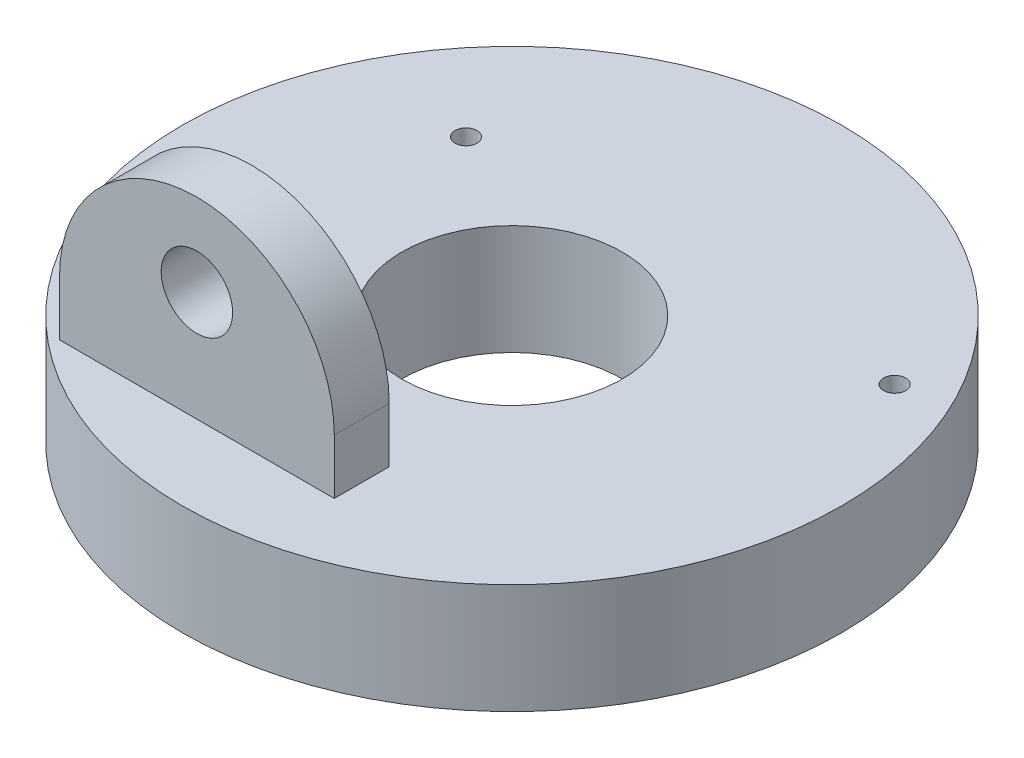
ISO-10303-21;
HEADER;
FILE_DESCRIPTION(('STEP AP214'),'2;1');
FILE_NAME('part.step','',(''),(''),'','','');
FILE_SCHEMA(('AUTOMOTIVE_DESIGN { 1 0 10303 214 1 1 1 1 }'));
ENDSEC;
DATA;
#1=APPLICATION_CONTEXT('core data for automotive mechanical design processes');
#2=APPLICATION_PROTOCOL_DEFINITION('international standard','automotive_design',2000,#1);
#3=PRODUCT_CONTEXT('',#1,'mechanical');
#4=PRODUCT('Part','Part','',(#3));
#5=PRODUCT_RELATED_PRODUCT_CATEGORY('part','',(#4));
#6=PRODUCT_DEFINITION_FORMATION('','',#4);
#7=PRODUCT_DEFINITION_CONTEXT('part definition',#1,'design');
#8=PRODUCT_DEFINITION('design','',#6,#7);
#9=PRODUCT_DEFINITION_SHAPE('','',#8);
#10=(LENGTH_UNIT() NAMED_UNIT(*) SI_UNIT(.MILLI.,.METRE.));
#11=(NAMED_UNIT(*) PLANE_ANGLE_UNIT() SI_UNIT($,.RADIAN.));
#12=(NAMED_UNIT(*) SI_UNIT($,.STERADIAN.) SOLID_ANGLE_UNIT());
#13=UNCERTAINTY_MEASURE_WITH_UNIT(LENGTH_MEASURE(1.E-05),#10,'distance_accuracy_value','');
#14=(GEOMETRIC_REPRESENTATION_CONTEXT(3) GLOBAL_UNCERTAINTY_ASSIGNED_CONTEXT((#13)) GLOBAL_UNIT_ASSIGNED_CONTEXT((#10,
#11,#12)) REPRESENTATION_CONTEXT('',''));
#15=CARTESIAN_POINT('',(0.,0.,0.));
#16=DIRECTION('',(0.,0.,1.));
#17=DIRECTION('',(1.,0.,0.));
#18=AXIS2_PLACEMENT_3D('',#15,#16,#17);
#19=CARTESIAN_POINT('',(-32.3448913021792,-5.65685425442422,-23.9783943291835));
#20=DIRECTION('',(0.,1.,0.));
#21=DIRECTION('',(0.,0.,1.));
#22=AXIS2_PLACEMENT_3D('',#19,#20,#21);
#23=CYLINDRICAL_SURFACE('',#22,2.00000000174366);
#24=CARTESIAN_POINT('',(-32.3448913021792,20.,-23.9783943291835));
#25=DIRECTION('',(0.,1.,0.));
#26=DIRECTION('',(0.,0.,1.));
#27=AXIS2_PLACEMENT_3D('',#24,#25,#26);
#28=CIRCLE('',#27,2.00000000174366);
#29=CARTESIAN_POINT('',(-32.3448913021792,20.,-21.9783943274399));
#30=VERTEX_POINT('',#29);
#31=EDGE_CURVE('E131',#30,#30,#28,.T.);
#32=ORIENTED_EDGE('',*,*,#31,.T.);
#33=EDGE_LOOP('',(#32));
#34=FACE_BOUND('',#33,.T.);
#35=CARTESIAN_POINT('',(-32.3448913021792,4.,-23.9783943291835));
#36=DIRECTION('',(0.,-1.,0.));
#37=DIRECTION('',(0.,0.,-1.));
#38=AXIS2_PLACEMENT_3D('',#35,#36,#37);
#39=CIRCLE('',#38,2.00000000174366);
#40=CARTESIAN_POINT('',(-32.3448913021792,4.,-25.9783943309272));
#41=VERTEX_POINT('',#40);
#42=EDGE_CURVE('E47',#41,#41,#39,.F.);
#43=ORIENTED_EDGE('',*,*,#42,.F.);
#44=EDGE_LOOP('',(#43));
#45=FACE_BOUND('',#44,.T.);
#46=ADVANCED_FACE('F43',(#34,#45),#23,.F.);
#47=CARTESIAN_POINT('',(45.6551086978208,-5.65685425442422,-23.9783943291835));
#48=DIRECTION('',(0.,1.,0.));
#49=DIRECTION('',(0.,0.,1.));
#50=AXIS2_PLACEMENT_3D('',#47,#48,#49);
#51=CYLINDRICAL_SURFACE('',#50,2.00000000174367);
#52=CARTESIAN_POINT('',(45.6551086978208,20.,-23.9783943291835));
#53=DIRECTION('',(0.,1.,0.));
#54=DIRECTION('',(0.,0.,1.));
#55=AXIS2_PLACEMENT_3D('',#52,#53,#54);
#56=CIRCLE('',#55,2.00000000174367);
#57=CARTESIAN_POINT('',(45.6551086978208,20.,-21.9783943274398));
#58=VERTEX_POINT('',#57);
#59=EDGE_CURVE('E146',#58,#58,#56,.T.);
#60=ORIENTED_EDGE('',*,*,#59,.T.);
#61=EDGE_LOOP('',(#60));
#62=FACE_BOUND('',#61,.T.);
#63=CARTESIAN_POINT('',(45.6551086978208,4.,-23.9783943291835));
#64=DIRECTION('',(0.,-1.,0.));
#65=DIRECTION('',(0.,0.,-1.));
#66=AXIS2_PLACEMENT_3D('',#63,#64,#65);
#67=CIRCLE('',#66,2.00000000174367);
#68=CARTESIAN_POINT('',(45.6551086978208,4.,-25.9783943309272));
#69=VERTEX_POINT('',#68);
#70=EDGE_CURVE('E125',#69,#69,#67,.F.);
#71=ORIENTED_EDGE('',*,*,#70,.F.);
#72=EDGE_LOOP('',(#71));
#73=FACE_BOUND('',#72,.T.);
#74=ADVANCED_FACE('F167',(#62,#73),#51,.F.);
#75=CARTESIAN_POINT('',(0.,20.,0.));
#76=DIRECTION('',(0.,1.,0.));
#77=DIRECTION('',(0.,0.,1.));
#78=AXIS2_PLACEMENT_3D('',#75,#76,#77);
#79=PLANE('',#78);
#80=ORIENTED_EDGE('',*,*,#59,.F.);
#81=EDGE_LOOP('',(#80));
#82=FACE_BOUND('',#81,.T.);
#83=ORIENTED_EDGE('',*,*,#31,.F.);
#84=EDGE_LOOP('',(#83));
#85=FACE_BOUND('',#84,.T.);
#86=CARTESIAN_POINT('',(0.,20.,0.));
#87=DIRECTION('',(0.,1.,0.));
#88=DIRECTION('',(0.,0.,1.));
#89=AXIS2_PLACEMENT_3D('',#86,#87,#88);
#90=CIRCLE('',#89,20.05);
#91=CARTESIAN_POINT('',(0.,20.,20.05));
#92=VERTEX_POINT('',#91);
#93=EDGE_CURVE('E157',#92,#92,#90,.T.);
#94=ORIENTED_EDGE('',*,*,#93,.F.);
#95=EDGE_LOOP('',(#94));
#96=FACE_BOUND('',#95,.T.);
#97=CARTESIAN_POINT('',(0.,20.,0.));
#98=DIRECTION('',(0.,1.,0.));
#99=DIRECTION('',(0.,0.,1.));
#100=AXIS2_PLACEMENT_3D('',#97,#98,#99);
#101=CIRCLE('',#100,60.);
#102=CARTESIAN_POINT('',(0.,20.,60.));
#103=VERTEX_POINT('',#102);
#104=EDGE_CURVE('E11',#103,#103,#101,.T.);
#105=ORIENTED_EDGE('',*,*,#104,.T.);
#106=EDGE_LOOP('',(#105));
#107=FACE_BOUND('',#106,.T.);
#108=DIRECTION('',(0.,0.,1.));
#109=VECTOR('',#108,1.);
#110=CARTESIAN_POINT('',(-37.3448913032883,20.,35.));
#111=LINE('',#110,#109);
#112=CARTESIAN_POINT('',(-37.3448913032883,20.,35.));
#113=VERTEX_POINT('',#112);
#114=CARTESIAN_POINT('',(-37.3448913032883,20.,45.));
#115=VERTEX_POINT('',#114);
#116=EDGE_CURVE('E60',#113,#115,#111,.T.);
#117=ORIENTED_EDGE('',*,*,#116,.F.);
#118=DIRECTION('',(1.,0.,0.));
#119=VECTOR('',#118,1.);
#120=CARTESIAN_POINT('',(-37.3448913032883,20.,35.));
#121=LINE('',#120,#119);
#122=CARTESIAN_POINT('',(12.6551086967117,20.,35.));
#123=VERTEX_POINT('',#122);
#124=EDGE_CURVE('E64',#113,#123,#121,.T.);
#125=ORIENTED_EDGE('',*,*,#124,.T.);
#126=DIRECTION('',(0.,0.,1.));
#127=VECTOR('',#126,1.);
#128=CARTESIAN_POINT('',(12.6551086967117,20.,35.));
#129=LINE('',#128,#127);
#130=CARTESIAN_POINT('',(12.6551086967117,20.,45.));
#131=VERTEX_POINT('',#130);
#132=EDGE_CURVE('E96',#123,#131,#129,.T.);
#133=ORIENTED_EDGE('',*,*,#132,.T.);
#134=DIRECTION('',(1.,0.,0.));
#135=VECTOR('',#134,1.);
#136=CARTESIAN_POINT('',(-37.3448913032883,20.,45.));
#137=LINE('',#136,#135);
#138=EDGE_CURVE('E112',#115,#131,#137,.T.);
#139=ORIENTED_EDGE('',*,*,#138,.F.);
#140=EDGE_LOOP('',(#117,#125,#133,#139));
#141=FACE_BOUND('',#140,.T.);
#142=ADVANCED_FACE('F164',(#82,#85,#96,#107,#141),#79,.T.);
#143=CARTESIAN_POINT('',(0.,20.,0.));
#144=DIRECTION('',(0.,-1.,0.));
#145=DIRECTION('',(0.,0.,-1.));
#146=AXIS2_PLACEMENT_3D('',#143,#144,#145);
#147=CYLINDRICAL_SURFACE('',#146,60.);
#148=ORIENTED_EDGE('',*,*,#104,.F.);
#149=EDGE_LOOP('',(#148));
#150=FACE_BOUND('',#149,.T.);
#151=CARTESIAN_POINT('',(0.,0.,0.));
#152=DIRECTION('',(0.,1.,0.));
#153=DIRECTION('',(0.,0.,1.));
#154=AXIS2_PLACEMENT_3D('',#151,#152,#153);
#155=CIRCLE('',#154,60.);
#156=CARTESIAN_POINT('',(0.,0.,60.));
#157=VERTEX_POINT('',#156);
#158=EDGE_CURVE('E52',#157,#157,#155,.T.);
#159=ORIENTED_EDGE('',*,*,#158,.T.);
#160=EDGE_LOOP('',(#159));
#161=FACE_BOUND('',#160,.T.);
#162=ADVANCED_FACE('F45',(#150,#161),#147,.T.);
#163=CARTESIAN_POINT('',(0.,0.,0.));
#164=DIRECTION('',(0.,1.,0.));
#165=DIRECTION('',(0.,0.,1.));
#166=AXIS2_PLACEMENT_3D('',#163,#164,#165);
#167=PLANE('',#166);
#168=CARTESIAN_POINT('',(45.6551086978208,0.,-23.9783943291835));
#169=DIRECTION('',(0.,-1.,0.));
#170=DIRECTION('',(0.,0.,-1.));
#171=AXIS2_PLACEMENT_3D('',#168,#169,#170);
#172=CIRCLE('',#171,3.99999999613521);
#173=CARTESIAN_POINT('',(45.6551086978208,0.,-27.9783943253187));
#174=VERTEX_POINT('',#173);
#175=EDGE_CURVE('E133',#174,#174,#172,.T.);
#176=ORIENTED_EDGE('',*,*,#175,.F.);
#177=EDGE_LOOP('',(#176));
#178=FACE_BOUND('',#177,.T.);
#179=CARTESIAN_POINT('',(-32.3448913021792,0.,-23.9783943291835));
#180=DIRECTION('',(0.,-1.,0.));
#181=DIRECTION('',(0.,0.,-1.));
#182=AXIS2_PLACEMENT_3D('',#179,#180,#181);
#183=CIRCLE('',#182,3.9999999961352);
#184=CARTESIAN_POINT('',(-32.3448913021792,0.,-27.9783943253187));
#185=VERTEX_POINT('',#184);
#186=EDGE_CURVE('E138',#185,#185,#183,.T.);
#187=ORIENTED_EDGE('',*,*,#186,.F.);
#188=EDGE_LOOP('',(#187));
#189=FACE_BOUND('',#188,.T.);
#190=CARTESIAN_POINT('',(0.,0.,0.));
#191=DIRECTION('',(0.,1.,0.));
#192=DIRECTION('',(0.,0.,1.));
#193=AXIS2_PLACEMENT_3D('',#190,#191,#192);
#194=CIRCLE('',#193,20.05);
#195=CARTESIAN_POINT('',(0.,0.,20.05));
#196=VERTEX_POINT('',#195);
#197=EDGE_CURVE('E116',#196,#196,#194,.T.);
#198=ORIENTED_EDGE('',*,*,#197,.T.);
#199=EDGE_LOOP('',(#198));
#200=FACE_BOUND('',#199,.T.);
#201=ORIENTED_EDGE('',*,*,#158,.F.);
#202=EDGE_LOOP('',(#201));
#203=FACE_BOUND('',#202,.T.);
#204=ADVANCED_FACE('F174',(#178,#189,#200,#203),#167,.F.);
#205=CARTESIAN_POINT('',(-37.3448913032883,20.,35.));
#206=DIRECTION('',(-1.,0.,0.));
#207=DIRECTION('',(0.,0.,1.));
#208=AXIS2_PLACEMENT_3D('',#205,#206,#207);
#209=PLANE('',#208);
#210=DIRECTION('',(0.,-1.,0.));
#211=VECTOR('',#210,1.);
#212=CARTESIAN_POINT('',(-37.3448913032883,20.,45.));
#213=LINE('',#212,#211);
#214=CARTESIAN_POINT('',(-37.3448913032883,30.,45.));
#215=VERTEX_POINT('',#214);
#216=EDGE_CURVE('E107',#215,#115,#213,.T.);
#217=ORIENTED_EDGE('',*,*,#216,.F.);
#218=DIRECTION('',(0.,0.,1.));
#219=VECTOR('',#218,1.);
#220=CARTESIAN_POINT('',(-37.3448913032883,30.,35.));
#221=LINE('',#220,#219);
#222=CARTESIAN_POINT('',(-37.3448913032883,30.,35.));
#223=VERTEX_POINT('',#222);
#224=EDGE_CURVE('E95',#223,#215,#221,.T.);
#225=ORIENTED_EDGE('',*,*,#224,.F.);
#226=DIRECTION('',(0.,-1.,0.));
#227=VECTOR('',#226,1.);
#228=CARTESIAN_POINT('',(-37.3448913032883,20.,35.));
#229=LINE('',#228,#227);
#230=EDGE_CURVE('E103',#223,#113,#229,.T.);
#231=ORIENTED_EDGE('',*,*,#230,.T.);
#232=ORIENTED_EDGE('',*,*,#116,.T.);
#233=EDGE_LOOP('',(#217,#225,#231,#232));
#234=FACE_BOUND('',#233,.T.);
#235=ADVANCED_FACE('F178',(#234),#209,.T.);
#236=CARTESIAN_POINT('',(-12.3448913032883,30.,35.));
#237=DIRECTION('',(0.,0.,1.));
#238=DIRECTION('',(1.,0.,0.));
#239=AXIS2_PLACEMENT_3D('',#236,#237,#238);
#240=CYLINDRICAL_SURFACE('',#239,25.);
#241=CARTESIAN_POINT('',(-12.3448913032883,30.,45.));
#242=DIRECTION('',(0.,0.,1.));
#243=DIRECTION('',(1.,0.,0.));
#244=AXIS2_PLACEMENT_3D('',#241,#242,#243);
#245=CIRCLE('',#244,25.);
#246=CARTESIAN_POINT('',(12.6551086967117,30.,45.));
#247=VERTEX_POINT('',#246);
#248=EDGE_CURVE('E90',#247,#215,#245,.T.);
#249=ORIENTED_EDGE('',*,*,#248,.F.);
#250=DIRECTION('',(0.,0.,1.));
#251=VECTOR('',#250,1.);
#252=CARTESIAN_POINT('',(12.6551086967117,30.,35.));
#253=LINE('',#252,#251);
#254=CARTESIAN_POINT('',(12.6551086967117,30.,35.));
#255=VERTEX_POINT('',#254);
#256=EDGE_CURVE('E84',#255,#247,#253,.T.);
#257=ORIENTED_EDGE('',*,*,#256,.F.);
#258=CARTESIAN_POINT('',(-12.3448913032883,30.,35.));
#259=DIRECTION('',(0.,0.,1.));
#260=DIRECTION('',(1.,0.,0.));
#261=AXIS2_PLACEMENT_3D('',#258,#259,#260);
#262=CIRCLE('',#261,25.);
#263=EDGE_CURVE('E87',#255,#223,#262,.T.);
#264=ORIENTED_EDGE('',*,*,#263,.T.);
#265=ORIENTED_EDGE('',*,*,#224,.T.);
#266=EDGE_LOOP('',(#249,#257,#264,#265));
#267=FACE_BOUND('',#266,.T.);
#268=ADVANCED_FACE('F86',(#267),#240,.T.);
#269=CARTESIAN_POINT('',(12.6551086967117,20.,35.));
#270=DIRECTION('',(1.,0.,0.));
#271=DIRECTION('',(0.,1.,0.));
#272=AXIS2_PLACEMENT_3D('',#269,#270,#271);
#273=PLANE('',#272);
#274=DIRECTION('',(0.,1.,0.));
#275=VECTOR('',#274,1.);
#276=CARTESIAN_POINT('',(12.6551086967117,20.,45.));
#277=LINE('',#276,#275);
#278=EDGE_CURVE('E115',#131,#247,#277,.T.);
#279=ORIENTED_EDGE('',*,*,#278,.F.);
#280=ORIENTED_EDGE('',*,*,#132,.F.);
#281=DIRECTION('',(0.,1.,0.));
#282=VECTOR('',#281,1.);
#283=CARTESIAN_POINT('',(12.6551086967117,20.,35.));
#284=LINE('',#283,#282);
#285=EDGE_CURVE('E101',#123,#255,#284,.T.);
#286=ORIENTED_EDGE('',*,*,#285,.T.);
#287=ORIENTED_EDGE('',*,*,#256,.T.);
#288=EDGE_LOOP('',(#279,#280,#286,#287));
#289=FACE_BOUND('',#288,.T.);
#290=ADVANCED_FACE('F105',(#289),#273,.T.);
#291=CARTESIAN_POINT('',(-12.3448913032883,30.,35.));
#292=DIRECTION('',(0.,0.,1.));
#293=DIRECTION('',(1.,0.,0.));
#294=AXIS2_PLACEMENT_3D('',#291,#292,#293);
#295=PLANE('',#294);
#296=CARTESIAN_POINT('',(-12.3448913032883,40.,35.));
#297=DIRECTION('',(0.,0.,1.));
#298=DIRECTION('',(1.,0.,0.));
#299=AXIS2_PLACEMENT_3D('',#296,#297,#298);
#300=CIRCLE('',#299,6.5);
#301=CARTESIAN_POINT('',(-5.84489130328831,40.,35.));
#302=VERTEX_POINT('',#301);
#303=EDGE_CURVE('E154',#302,#302,#300,.F.);
#304=ORIENTED_EDGE('',*,*,#303,.F.);
#305=EDGE_LOOP('',(#304));
#306=FACE_BOUND('',#305,.T.);
#307=ORIENTED_EDGE('',*,*,#124,.F.);
#308=ORIENTED_EDGE('',*,*,#230,.F.);
#309=ORIENTED_EDGE('',*,*,#263,.F.);
#310=ORIENTED_EDGE('',*,*,#285,.F.);
#311=EDGE_LOOP('',(#307,#308,#309,#310));
#312=FACE_BOUND('',#311,.T.);
#313=ADVANCED_FACE('F100',(#306,#312),#295,.F.);
#314=CARTESIAN_POINT('',(-12.3448913032883,30.,45.));
#315=DIRECTION('',(0.,0.,1.));
#316=DIRECTION('',(1.,0.,0.));
#317=AXIS2_PLACEMENT_3D('',#314,#315,#316);
#318=PLANE('',#317);
#319=CARTESIAN_POINT('',(-12.3448913032883,40.,45.));
#320=DIRECTION('',(0.,0.,1.));
#321=DIRECTION('',(1.,0.,0.));
#322=AXIS2_PLACEMENT_3D('',#319,#320,#321);
#323=CIRCLE('',#322,6.5);
#324=CARTESIAN_POINT('',(-5.84489130328831,40.,45.));
#325=VERTEX_POINT('',#324);
#326=EDGE_CURVE('E149',#325,#325,#323,.T.);
#327=ORIENTED_EDGE('',*,*,#326,.F.);
#328=EDGE_LOOP('',(#327));
#329=FACE_BOUND('',#328,.T.);
#330=ORIENTED_EDGE('',*,*,#138,.T.);
#331=ORIENTED_EDGE('',*,*,#278,.T.);
#332=ORIENTED_EDGE('',*,*,#248,.T.);
#333=ORIENTED_EDGE('',*,*,#216,.T.);
#334=EDGE_LOOP('',(#330,#331,#332,#333));
#335=FACE_BOUND('',#334,.T.);
#336=ADVANCED_FACE('F206',(#329,#335),#318,.T.);
#337=CARTESIAN_POINT('',(0.,0.,0.));
#338=DIRECTION('',(0.,1.,0.));
#339=DIRECTION('',(0.,0.,1.));
#340=AXIS2_PLACEMENT_3D('',#337,#338,#339);
#341=CYLINDRICAL_SURFACE('',#340,20.05);
#342=ORIENTED_EDGE('',*,*,#197,.F.);
#343=EDGE_LOOP('',(#342));
#344=FACE_BOUND('',#343,.T.);
#345=ORIENTED_EDGE('',*,*,#93,.T.);
#346=EDGE_LOOP('',(#345));
#347=FACE_BOUND('',#346,.T.);
#348=ADVANCED_FACE('F162',(#344,#347),#341,.F.);
#349=CARTESIAN_POINT('',(-12.3448913032883,40.,16.6152236891498));
#350=DIRECTION('',(0.,0.,1.));
#351=DIRECTION('',(1.,0.,0.));
#352=AXIS2_PLACEMENT_3D('',#349,#350,#351);
#353=CYLINDRICAL_SURFACE('',#352,6.5);
#354=ORIENTED_EDGE('',*,*,#303,.T.);
#355=EDGE_LOOP('',(#354));
#356=FACE_BOUND('',#355,.T.);
#357=ORIENTED_EDGE('',*,*,#326,.T.);
#358=EDGE_LOOP('',(#357));
#359=FACE_BOUND('',#358,.T.);
#360=ADVANCED_FACE('F199',(#356,#359),#353,.F.);
#361=CARTESIAN_POINT('',(45.6551086978208,4.,-23.9783943291835));
#362=DIRECTION('',(0.,-1.,0.));
#363=DIRECTION('',(0.,0.,-1.));
#364=AXIS2_PLACEMENT_3D('',#361,#362,#363);
#365=PLANE('',#364);
#366=CARTESIAN_POINT('',(45.6551086978208,4.,-23.9783943291835));
#367=DIRECTION('',(0.,-1.,0.));
#368=DIRECTION('',(0.,0.,-1.));
#369=AXIS2_PLACEMENT_3D('',#366,#367,#368);
#370=CIRCLE('',#369,3.99999999613521);
#371=CARTESIAN_POINT('',(45.6551086978208,4.,-27.9783943253187));
#372=VERTEX_POINT('',#371);
#373=EDGE_CURVE('E127',#372,#372,#370,.T.);
#374=ORIENTED_EDGE('',*,*,#373,.T.);
#375=EDGE_LOOP('',(#374));
#376=FACE_BOUND('',#375,.T.);
#377=ORIENTED_EDGE('',*,*,#70,.T.);
#378=EDGE_LOOP('',(#377));
#379=FACE_BOUND('',#378,.T.);
#380=ADVANCED_FACE('F202',(#376,#379),#365,.T.);
#381=CARTESIAN_POINT('',(45.6551086978208,4.,-23.9783943291835));
#382=DIRECTION('',(0.,-1.,0.));
#383=DIRECTION('',(0.,0.,-1.));
#384=AXIS2_PLACEMENT_3D('',#381,#382,#383);
#385=CYLINDRICAL_SURFACE('',#384,3.99999999613521);
#386=ORIENTED_EDGE('',*,*,#373,.F.);
#387=EDGE_LOOP('',(#386));
#388=FACE_BOUND('',#387,.T.);
#389=ORIENTED_EDGE('',*,*,#175,.T.);
#390=EDGE_LOOP('',(#389));
#391=FACE_BOUND('',#390,.T.);
#392=ADVANCED_FACE('F281',(#388,#391),#385,.F.);
#393=CARTESIAN_POINT('',(-32.3448913021792,4.,-23.9783943291835));
#394=DIRECTION('',(0.,-1.,0.));
#395=DIRECTION('',(0.,0.,-1.));
#396=AXIS2_PLACEMENT_3D('',#393,#394,#395);
#397=PLANE('',#396);
#398=CARTESIAN_POINT('',(-32.3448913021792,4.,-23.9783943291835));
#399=DIRECTION('',(0.,-1.,0.));
#400=DIRECTION('',(0.,0.,-1.));
#401=AXIS2_PLACEMENT_3D('',#398,#399,#400);
#402=CIRCLE('',#401,3.9999999961352);
#403=CARTESIAN_POINT('',(-32.3448913021792,4.,-27.9783943253187));
#404=VERTEX_POINT('',#403);
#405=EDGE_CURVE('E143',#404,#404,#402,.T.);
#406=ORIENTED_EDGE('',*,*,#405,.T.);
#407=EDGE_LOOP('',(#406));
#408=FACE_BOUND('',#407,.T.);
#409=ORIENTED_EDGE('',*,*,#42,.T.);
#410=EDGE_LOOP('',(#409));
#411=FACE_BOUND('',#410,.T.);
#412=ADVANCED_FACE('F289',(#408,#411),#397,.T.);
#413=CARTESIAN_POINT('',(-32.3448913021792,4.,-23.9783943291835));
#414=DIRECTION('',(0.,-1.,0.));
#415=DIRECTION('',(0.,0.,-1.));
#416=AXIS2_PLACEMENT_3D('',#413,#414,#415);
#417=CYLINDRICAL_SURFACE('',#416,3.9999999961352);
#418=ORIENTED_EDGE('',*,*,#405,.F.);
#419=EDGE_LOOP('',(#418));
#420=FACE_BOUND('',#419,.T.);
#421=ORIENTED_EDGE('',*,*,#186,.T.);
#422=EDGE_LOOP('',(#421));
#423=FACE_BOUND('',#422,.T.);
#424=ADVANCED_FACE('F298',(#420,#423),#417,.F.);
#425=CLOSED_SHELL('',(#46,#74,#142,#162,#204,#235,#268,#290,#313,#336,#348,#360,#380,#392,#412,#424));
#426=MANIFOLD_SOLID_BREP('B2',#425);
#427=ADVANCED_BREP_SHAPE_REPRESENTATION('',(#18,#426),#14);
#428=SHAPE_DEFINITION_REPRESENTATION(#9,#427);
ENDSEC;
END-ISO-10303-21;
